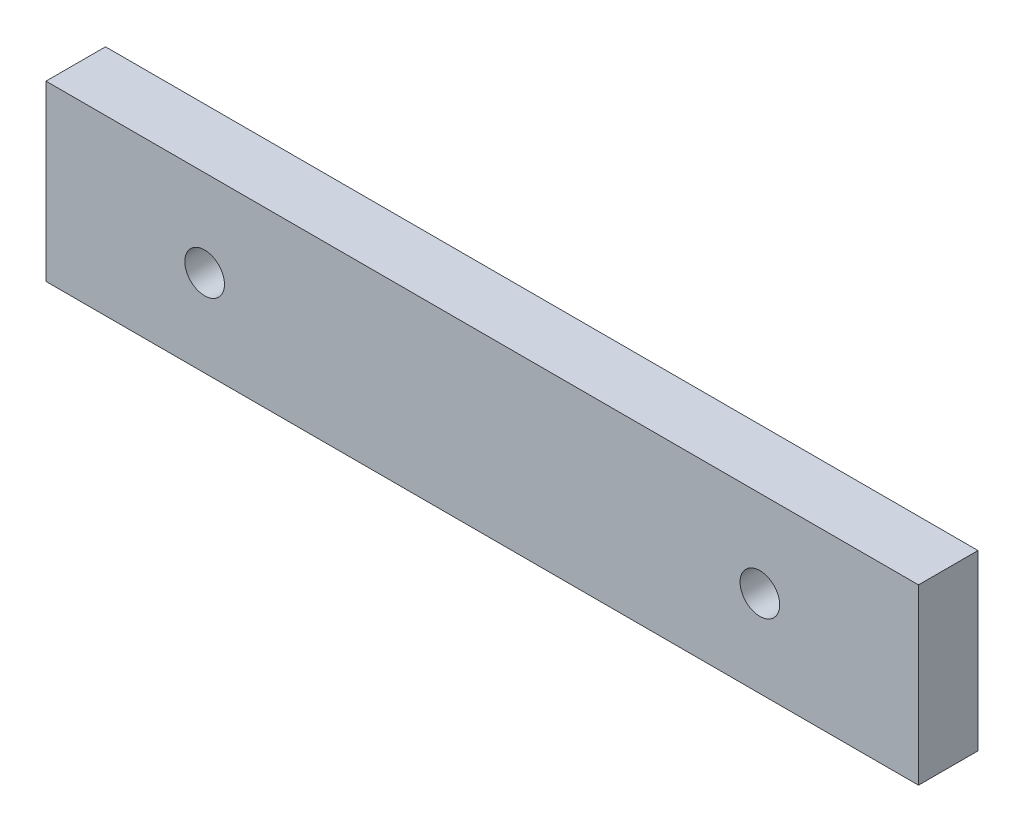
ISO-10303-21;
HEADER;
FILE_DESCRIPTION(('STEP AP214'),'2;1');
FILE_NAME('part.step','',(''),(''),'','','');
FILE_SCHEMA(('AUTOMOTIVE_DESIGN { 1 0 10303 214 1 1 1 1 }'));
ENDSEC;
DATA;
#1=APPLICATION_CONTEXT('core data for automotive mechanical design processes');
#2=APPLICATION_PROTOCOL_DEFINITION('international standard','automotive_design',2000,#1);
#3=PRODUCT_CONTEXT('',#1,'mechanical');
#4=PRODUCT('Part','Part','',(#3));
#5=PRODUCT_RELATED_PRODUCT_CATEGORY('part','',(#4));
#6=PRODUCT_DEFINITION_FORMATION('','',#4);
#7=PRODUCT_DEFINITION_CONTEXT('part definition',#1,'design');
#8=PRODUCT_DEFINITION('design','',#6,#7);
#9=PRODUCT_DEFINITION_SHAPE('','',#8);
#10=(LENGTH_UNIT() NAMED_UNIT(*) SI_UNIT(.MILLI.,.METRE.));
#11=(NAMED_UNIT(*) PLANE_ANGLE_UNIT() SI_UNIT($,.RADIAN.));
#12=(NAMED_UNIT(*) SI_UNIT($,.STERADIAN.) SOLID_ANGLE_UNIT());
#13=UNCERTAINTY_MEASURE_WITH_UNIT(LENGTH_MEASURE(1.E-05),#10,'distance_accuracy_value','');
#14=(GEOMETRIC_REPRESENTATION_CONTEXT(3) GLOBAL_UNCERTAINTY_ASSIGNED_CONTEXT((#13)) GLOBAL_UNIT_ASSIGNED_CONTEXT((#10,
#11,#12)) REPRESENTATION_CONTEXT('',''));
#15=CARTESIAN_POINT('',(0.,0.,0.));
#16=DIRECTION('',(0.,0.,1.));
#17=DIRECTION('',(1.,0.,0.));
#18=AXIS2_PLACEMENT_3D('',#15,#16,#17);
#19=CARTESIAN_POINT('',(0.,0.,12.));
#20=DIRECTION('',(0.,0.,1.));
#21=DIRECTION('',(1.,0.,0.));
#22=AXIS2_PLACEMENT_3D('',#19,#20,#21);
#23=PLANE('',#22);
#24=CARTESIAN_POINT('',(-56.,0.,12.));
#25=DIRECTION('',(0.,0.,1.));
#26=DIRECTION('',(1.,0.,0.));
#27=AXIS2_PLACEMENT_3D('',#24,#25,#26);
#28=CIRCLE('',#27,4.);
#29=CARTESIAN_POINT('',(-52.,0.,12.));
#30=VERTEX_POINT('',#29);
#31=EDGE_CURVE('E100',#30,#30,#28,.T.);
#32=ORIENTED_EDGE('',*,*,#31,.F.);
#33=EDGE_LOOP('',(#32));
#34=FACE_BOUND('',#33,.T.);
#35=DIRECTION('',(0.,1.,0.));
#36=VECTOR('',#35,1.);
#37=CARTESIAN_POINT('',(88.,17.5,12.));
#38=LINE('',#37,#36);
#39=CARTESIAN_POINT('',(88.,-17.5,12.));
#40=VERTEX_POINT('',#39);
#41=CARTESIAN_POINT('',(88.,17.5,12.));
#42=VERTEX_POINT('',#41);
#43=EDGE_CURVE('E85',#40,#42,#38,.T.);
#44=ORIENTED_EDGE('',*,*,#43,.T.);
#45=DIRECTION('',(-1.,0.,0.));
#46=VECTOR('',#45,1.);
#47=CARTESIAN_POINT('',(-88.,17.5,12.));
#48=LINE('',#47,#46);
#49=CARTESIAN_POINT('',(-88.,17.5,12.));
#50=VERTEX_POINT('',#49);
#51=EDGE_CURVE('E80',#42,#50,#48,.T.);
#52=ORIENTED_EDGE('',*,*,#51,.T.);
#53=DIRECTION('',(0.,-1.,0.));
#54=VECTOR('',#53,1.);
#55=CARTESIAN_POINT('',(-88.,17.5,12.));
#56=LINE('',#55,#54);
#57=CARTESIAN_POINT('',(-88.,-17.5,12.));
#58=VERTEX_POINT('',#57);
#59=EDGE_CURVE('E83',#50,#58,#56,.T.);
#60=ORIENTED_EDGE('',*,*,#59,.T.);
#61=DIRECTION('',(1.,0.,0.));
#62=VECTOR('',#61,1.);
#63=CARTESIAN_POINT('',(-88.,-17.5,12.));
#64=LINE('',#63,#62);
#65=EDGE_CURVE('E50',#58,#40,#64,.T.);
#66=ORIENTED_EDGE('',*,*,#65,.T.);
#67=EDGE_LOOP('',(#44,#52,#60,#66));
#68=FACE_BOUND('',#67,.T.);
#69=CARTESIAN_POINT('',(56.,0.,12.));
#70=DIRECTION('',(0.,0.,1.));
#71=DIRECTION('',(1.,0.,0.));
#72=AXIS2_PLACEMENT_3D('',#69,#70,#71);
#73=CIRCLE('',#72,4.);
#74=CARTESIAN_POINT('',(60.,0.,12.));
#75=VERTEX_POINT('',#74);
#76=EDGE_CURVE('E115',#75,#75,#73,.T.);
#77=ORIENTED_EDGE('',*,*,#76,.F.);
#78=EDGE_LOOP('',(#77));
#79=FACE_BOUND('',#78,.T.);
#80=ADVANCED_FACE('F33',(#34,#68,#79),#23,.T.);
#81=CARTESIAN_POINT('',(0.,0.,0.));
#82=DIRECTION('',(0.,0.,1.));
#83=DIRECTION('',(1.,0.,0.));
#84=AXIS2_PLACEMENT_3D('',#81,#82,#83);
#85=PLANE('',#84);
#86=DIRECTION('',(0.,1.,0.));
#87=VECTOR('',#86,1.);
#88=CARTESIAN_POINT('',(88.,17.5,0.));
#89=LINE('',#88,#87);
#90=CARTESIAN_POINT('',(88.,-17.5,0.));
#91=VERTEX_POINT('',#90);
#92=CARTESIAN_POINT('',(88.,17.5,0.));
#93=VERTEX_POINT('',#92);
#94=EDGE_CURVE('E97',#91,#93,#89,.T.);
#95=ORIENTED_EDGE('',*,*,#94,.F.);
#96=DIRECTION('',(1.,0.,0.));
#97=VECTOR('',#96,1.);
#98=CARTESIAN_POINT('',(-88.,-17.5,0.));
#99=LINE('',#98,#97);
#100=CARTESIAN_POINT('',(-88.,-17.5,0.));
#101=VERTEX_POINT('',#100);
#102=EDGE_CURVE('E73',#101,#91,#99,.T.);
#103=ORIENTED_EDGE('',*,*,#102,.F.);
#104=DIRECTION('',(0.,-1.,0.));
#105=VECTOR('',#104,1.);
#106=CARTESIAN_POINT('',(-88.,17.5,0.));
#107=LINE('',#106,#105);
#108=CARTESIAN_POINT('',(-88.,17.5,0.));
#109=VERTEX_POINT('',#108);
#110=EDGE_CURVE('E67',#109,#101,#107,.T.);
#111=ORIENTED_EDGE('',*,*,#110,.F.);
#112=DIRECTION('',(-1.,0.,0.));
#113=VECTOR('',#112,1.);
#114=CARTESIAN_POINT('',(-88.,17.5,0.));
#115=LINE('',#114,#113);
#116=EDGE_CURVE('E89',#93,#109,#115,.T.);
#117=ORIENTED_EDGE('',*,*,#116,.F.);
#118=EDGE_LOOP('',(#95,#103,#111,#117));
#119=FACE_BOUND('',#118,.T.);
#120=CARTESIAN_POINT('',(-56.,0.,0.));
#121=DIRECTION('',(0.,0.,1.));
#122=DIRECTION('',(1.,0.,0.));
#123=AXIS2_PLACEMENT_3D('',#120,#121,#122);
#124=CIRCLE('',#123,4.);
#125=CARTESIAN_POINT('',(-52.,0.,0.));
#126=VERTEX_POINT('',#125);
#127=EDGE_CURVE('E112',#126,#126,#124,.T.);
#128=ORIENTED_EDGE('',*,*,#127,.T.);
#129=EDGE_LOOP('',(#128));
#130=FACE_BOUND('',#129,.T.);
#131=CARTESIAN_POINT('',(56.,0.,0.));
#132=DIRECTION('',(0.,0.,1.));
#133=DIRECTION('',(1.,0.,0.));
#134=AXIS2_PLACEMENT_3D('',#131,#132,#133);
#135=CIRCLE('',#134,4.);
#136=CARTESIAN_POINT('',(60.,0.,0.));
#137=VERTEX_POINT('',#136);
#138=EDGE_CURVE('E118',#137,#137,#135,.T.);
#139=ORIENTED_EDGE('',*,*,#138,.T.);
#140=EDGE_LOOP('',(#139));
#141=FACE_BOUND('',#140,.T.);
#142=ADVANCED_FACE('F108',(#119,#130,#141),#85,.F.);
#143=CARTESIAN_POINT('',(88.,17.5,12.));
#144=DIRECTION('',(-1.,0.,0.));
#145=DIRECTION('',(0.,0.,1.));
#146=AXIS2_PLACEMENT_3D('',#143,#144,#145);
#147=PLANE('',#146);
#148=ORIENTED_EDGE('',*,*,#94,.T.);
#149=DIRECTION('',(0.,0.,-1.));
#150=VECTOR('',#149,1.);
#151=CARTESIAN_POINT('',(88.,17.5,12.));
#152=LINE('',#151,#150);
#153=EDGE_CURVE('E11',#42,#93,#152,.T.);
#154=ORIENTED_EDGE('',*,*,#153,.F.);
#155=ORIENTED_EDGE('',*,*,#43,.F.);
#156=DIRECTION('',(0.,0.,-1.));
#157=VECTOR('',#156,1.);
#158=CARTESIAN_POINT('',(88.,-17.5,12.));
#159=LINE('',#158,#157);
#160=EDGE_CURVE('E93',#40,#91,#159,.T.);
#161=ORIENTED_EDGE('',*,*,#160,.T.);
#162=EDGE_LOOP('',(#148,#154,#155,#161));
#163=FACE_BOUND('',#162,.T.);
#164=ADVANCED_FACE('F35',(#163),#147,.F.);
#165=CARTESIAN_POINT('',(-88.,17.5,12.));
#166=DIRECTION('',(0.,-1.,0.));
#167=DIRECTION('',(0.,0.,-1.));
#168=AXIS2_PLACEMENT_3D('',#165,#166,#167);
#169=PLANE('',#168);
#170=ORIENTED_EDGE('',*,*,#116,.T.);
#171=DIRECTION('',(0.,0.,-1.));
#172=VECTOR('',#171,1.);
#173=CARTESIAN_POINT('',(-88.,17.5,12.));
#174=LINE('',#173,#172);
#175=EDGE_CURVE('E42',#50,#109,#174,.T.);
#176=ORIENTED_EDGE('',*,*,#175,.F.);
#177=ORIENTED_EDGE('',*,*,#51,.F.);
#178=ORIENTED_EDGE('',*,*,#153,.T.);
#179=EDGE_LOOP('',(#170,#176,#177,#178));
#180=FACE_BOUND('',#179,.T.);
#181=ADVANCED_FACE('F88',(#180),#169,.F.);
#182=CARTESIAN_POINT('',(-88.,17.5,12.));
#183=DIRECTION('',(1.,0.,0.));
#184=DIRECTION('',(0.,0.,-1.));
#185=AXIS2_PLACEMENT_3D('',#182,#183,#184);
#186=PLANE('',#185);
#187=ORIENTED_EDGE('',*,*,#110,.T.);
#188=DIRECTION('',(0.,0.,-1.));
#189=VECTOR('',#188,1.);
#190=CARTESIAN_POINT('',(-88.,-17.5,12.));
#191=LINE('',#190,#189);
#192=EDGE_CURVE('E90',#58,#101,#191,.T.);
#193=ORIENTED_EDGE('',*,*,#192,.F.);
#194=ORIENTED_EDGE('',*,*,#59,.F.);
#195=ORIENTED_EDGE('',*,*,#175,.T.);
#196=EDGE_LOOP('',(#187,#193,#194,#195));
#197=FACE_BOUND('',#196,.T.);
#198=ADVANCED_FACE('F91',(#197),#186,.F.);
#199=CARTESIAN_POINT('',(-88.,-17.5,12.));
#200=DIRECTION('',(0.,1.,0.));
#201=DIRECTION('',(0.,0.,1.));
#202=AXIS2_PLACEMENT_3D('',#199,#200,#201);
#203=PLANE('',#202);
#204=ORIENTED_EDGE('',*,*,#102,.T.);
#205=ORIENTED_EDGE('',*,*,#160,.F.);
#206=ORIENTED_EDGE('',*,*,#65,.F.);
#207=ORIENTED_EDGE('',*,*,#192,.T.);
#208=EDGE_LOOP('',(#204,#205,#206,#207));
#209=FACE_BOUND('',#208,.T.);
#210=ADVANCED_FACE('F105',(#209),#203,.F.);
#211=CARTESIAN_POINT('',(-56.,0.,12.));
#212=DIRECTION('',(0.,0.,-1.));
#213=DIRECTION('',(-1.,0.,0.));
#214=AXIS2_PLACEMENT_3D('',#211,#212,#213);
#215=CYLINDRICAL_SURFACE('',#214,4.);
#216=ORIENTED_EDGE('',*,*,#31,.T.);
#217=EDGE_LOOP('',(#216));
#218=FACE_BOUND('',#217,.T.);
#219=ORIENTED_EDGE('',*,*,#127,.F.);
#220=EDGE_LOOP('',(#219));
#221=FACE_BOUND('',#220,.T.);
#222=ADVANCED_FACE('F135',(#218,#221),#215,.F.);
#223=CARTESIAN_POINT('',(56.,0.,12.));
#224=DIRECTION('',(0.,0.,-1.));
#225=DIRECTION('',(-1.,0.,0.));
#226=AXIS2_PLACEMENT_3D('',#223,#224,#225);
#227=CYLINDRICAL_SURFACE('',#226,4.);
#228=ORIENTED_EDGE('',*,*,#76,.T.);
#229=EDGE_LOOP('',(#228));
#230=FACE_BOUND('',#229,.T.);
#231=ORIENTED_EDGE('',*,*,#138,.F.);
#232=EDGE_LOOP('',(#231));
#233=FACE_BOUND('',#232,.T.);
#234=ADVANCED_FACE('F124',(#230,#233),#227,.F.);
#235=CLOSED_SHELL('',(#80,#142,#164,#181,#198,#210,#222,#234));
#236=MANIFOLD_SOLID_BREP('B2',#235);
#237=ADVANCED_BREP_SHAPE_REPRESENTATION('',(#18,#236),#14);
#238=SHAPE_DEFINITION_REPRESENTATION(#9,#237);
ENDSEC;
END-ISO-10303-21;
